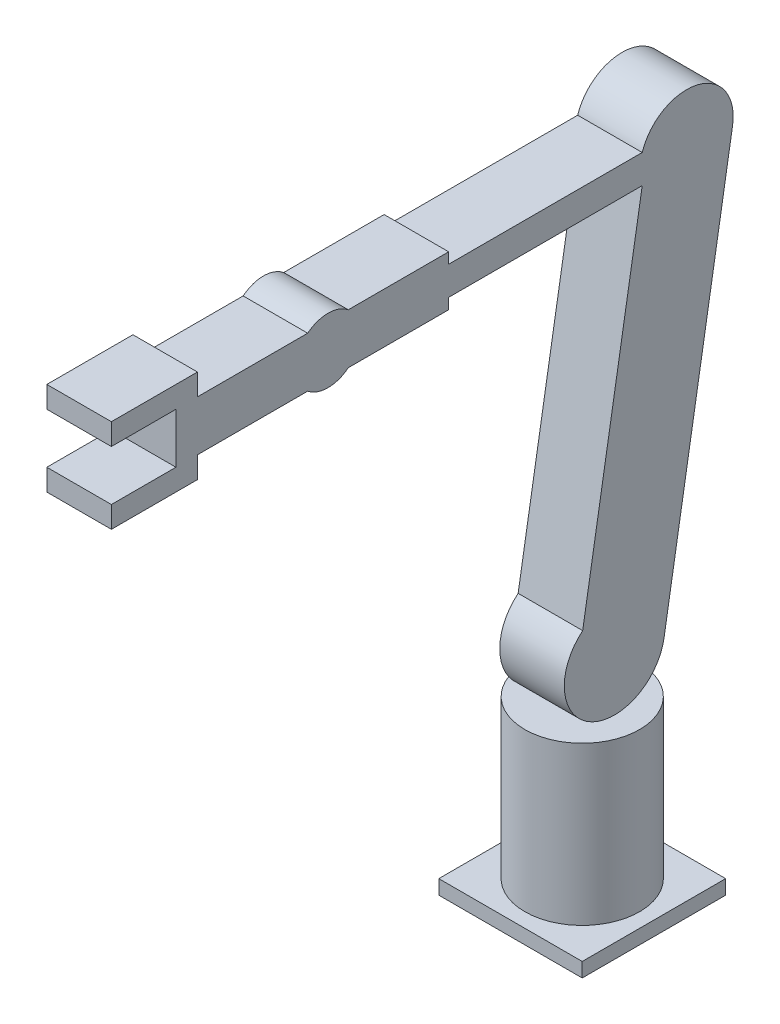
ISO-10303-21;
HEADER;
FILE_DESCRIPTION(('STEP AP214'),'2;1');
FILE_NAME('part.step','',(''),(''),'','','');
FILE_SCHEMA(('AUTOMOTIVE_DESIGN { 1 0 10303 214 1 1 1 1 }'));
ENDSEC;
DATA;
#1=APPLICATION_CONTEXT('core data for automotive mechanical design processes');
#2=APPLICATION_PROTOCOL_DEFINITION('international standard','automotive_design',2000,#1);
#3=PRODUCT_CONTEXT('',#1,'mechanical');
#4=PRODUCT('Part','Part','',(#3));
#5=PRODUCT_RELATED_PRODUCT_CATEGORY('part','',(#4));
#6=PRODUCT_DEFINITION_FORMATION('','',#4);
#7=PRODUCT_DEFINITION_CONTEXT('part definition',#1,'design');
#8=PRODUCT_DEFINITION('design','',#6,#7);
#9=PRODUCT_DEFINITION_SHAPE('','',#8);
#10=(LENGTH_UNIT() NAMED_UNIT(*) SI_UNIT(.MILLI.,.METRE.));
#11=(NAMED_UNIT(*) PLANE_ANGLE_UNIT() SI_UNIT($,.RADIAN.));
#12=(NAMED_UNIT(*) SI_UNIT($,.STERADIAN.) SOLID_ANGLE_UNIT());
#13=UNCERTAINTY_MEASURE_WITH_UNIT(LENGTH_MEASURE(1.E-05),#10,'distance_accuracy_value','');
#14=(GEOMETRIC_REPRESENTATION_CONTEXT(3) GLOBAL_UNCERTAINTY_ASSIGNED_CONTEXT((#13)) GLOBAL_UNIT_ASSIGNED_CONTEXT((#10,
#11,#12)) REPRESENTATION_CONTEXT('',''));
#15=CARTESIAN_POINT('',(0.,0.,0.));
#16=DIRECTION('',(0.,0.,1.));
#17=DIRECTION('',(1.,0.,0.));
#18=AXIS2_PLACEMENT_3D('',#15,#16,#17);
#19=CARTESIAN_POINT('',(-22.5,0.,0.));
#20=DIRECTION('',(1.,0.,0.));
#21=DIRECTION('',(0.,0.,-1.));
#22=AXIS2_PLACEMENT_3D('',#19,#20,#21);
#23=PLANE('',#22);
#24=CARTESIAN_POINT('',(-22.5,145.,0.));
#25=DIRECTION('',(1.,0.,0.));
#26=DIRECTION('',(0.,0.,-1.));
#27=AXIS2_PLACEMENT_3D('',#24,#25,#26);
#28=CIRCLE('',#27,35.);
#29=CARTESIAN_POINT('',(-22.5,172.073958792117,22.1810900391025));
#30=VERTEX_POINT('',#29);
#31=CARTESIAN_POINT('',(-22.5,139.220300396326,-34.5194882999631));
#32=VERTEX_POINT('',#31);
#33=EDGE_CURVE('E767',#30,#32,#28,.T.);
#34=ORIENTED_EDGE('',*,*,#33,.F.);
#35=DIRECTION('',(0.,0.98627109428466,-0.16513427439069));
#36=VECTOR('',#35,1.);
#37=CARTESIAN_POINT('',(-22.5,172.073958792117,22.1810900391025));
#38=LINE('',#37,#36);
#39=CARTESIAN_POINT('',(-22.5,420.,-19.3298973097812));
#40=VERTEX_POINT('',#39);
#41=EDGE_CURVE('E477',#30,#40,#38,.T.);
#42=ORIENTED_EDGE('',*,*,#41,.T.);
#43=DIRECTION('',(0.,0.,-1.));
#44=VECTOR('',#43,1.);
#45=CARTESIAN_POINT('',(-22.5,420.,115.604674874356));
#46=LINE('',#45,#44);
#47=CARTESIAN_POINT('',(-22.5,420.,115.604674874355));
#48=VERTEX_POINT('',#47);
#49=EDGE_CURVE('E557',#48,#40,#46,.T.);
#50=ORIENTED_EDGE('',*,*,#49,.F.);
#51=DIRECTION('',(0.,-1.,0.));
#52=VECTOR('',#51,1.);
#53=CARTESIAN_POINT('',(-22.5,447.5,115.604674874355));
#54=LINE('',#53,#52);
#55=CARTESIAN_POINT('',(-22.5,412.5,115.604674874355));
#56=VERTEX_POINT('',#55);
#57=EDGE_CURVE('E533',#48,#56,#54,.T.);
#58=ORIENTED_EDGE('',*,*,#57,.T.);
#59=DIRECTION('',(0.,0.,-1.));
#60=VECTOR('',#59,1.);
#61=CARTESIAN_POINT('',(-22.5,412.5,185.604674874355));
#62=LINE('',#61,#60);
#63=CARTESIAN_POINT('',(-22.5,412.5,185.604674874355));
#64=VERTEX_POINT('',#63);
#65=EDGE_CURVE('E529',#64,#56,#62,.T.);
#66=ORIENTED_EDGE('',*,*,#65,.F.);
#67=CARTESIAN_POINT('',(-22.5,430.,199.746810498086));
#68=DIRECTION('',(1.,0.,0.));
#69=DIRECTION('',(0.,0.,-1.));
#70=AXIS2_PLACEMENT_3D('',#67,#68,#69);
#71=CIRCLE('',#70,22.5);
#72=CARTESIAN_POINT('',(-22.5,412.5,213.888946121817));
#73=VERTEX_POINT('',#72);
#74=EDGE_CURVE('E510',#73,#64,#71,.T.);
#75=ORIENTED_EDGE('',*,*,#74,.F.);
#76=DIRECTION('',(0.,0.,1.));
#77=VECTOR('',#76,1.);
#78=CARTESIAN_POINT('',(-22.5,412.5,213.888946121817));
#79=LINE('',#78,#77);
#80=CARTESIAN_POINT('',(-22.5,412.5,290.746810498086));
#81=VERTEX_POINT('',#80);
#82=EDGE_CURVE('E479',#73,#81,#79,.T.);
#83=ORIENTED_EDGE('',*,*,#82,.T.);
#84=DIRECTION('',(0.,-1.,0.));
#85=VECTOR('',#84,1.);
#86=CARTESIAN_POINT('',(-22.5,462.5,290.746810498086));
#87=LINE('',#86,#85);
#88=CARTESIAN_POINT('',(-22.5,397.5,290.746810498086));
#89=VERTEX_POINT('',#88);
#90=EDGE_CURVE('E439',#81,#89,#87,.T.);
#91=ORIENTED_EDGE('',*,*,#90,.T.);
#92=DIRECTION('',(0.,0.,-1.));
#93=VECTOR('',#92,1.);
#94=CARTESIAN_POINT('',(-22.5,397.5,305.746810498086));
#95=LINE('',#94,#93);
#96=CARTESIAN_POINT('',(-22.5,397.5,350.746810498086));
#97=VERTEX_POINT('',#96);
#98=EDGE_CURVE('E432',#97,#89,#95,.T.);
#99=ORIENTED_EDGE('',*,*,#98,.F.);
#100=DIRECTION('',(0.,1.,0.));
#101=VECTOR('',#100,1.);
#102=CARTESIAN_POINT('',(-22.5,397.5,350.746810498086));
#103=LINE('',#102,#101);
#104=CARTESIAN_POINT('',(-22.5,412.5,350.746810498086));
#105=VERTEX_POINT('',#104);
#106=EDGE_CURVE('E436',#97,#105,#103,.T.);
#107=ORIENTED_EDGE('',*,*,#106,.T.);
#108=DIRECTION('',(0.,0.,1.));
#109=VECTOR('',#108,1.);
#110=CARTESIAN_POINT('',(-22.5,412.5,290.746810498086));
#111=LINE('',#110,#109);
#112=CARTESIAN_POINT('',(-22.5,412.5,305.746810498086));
#113=VERTEX_POINT('',#112);
#114=EDGE_CURVE('E426',#113,#105,#111,.T.);
#115=ORIENTED_EDGE('',*,*,#114,.F.);
#116=DIRECTION('',(0.,-1.,0.));
#117=VECTOR('',#116,1.);
#118=CARTESIAN_POINT('',(-22.5,462.5,305.746810498086));
#119=LINE('',#118,#117);
#120=CARTESIAN_POINT('',(-22.5,447.5,305.746810498086));
#121=VERTEX_POINT('',#120);
#122=EDGE_CURVE('E622',#121,#113,#119,.T.);
#123=ORIENTED_EDGE('',*,*,#122,.F.);
#124=DIRECTION('',(0.,0.,1.));
#125=VECTOR('',#124,1.);
#126=CARTESIAN_POINT('',(-22.5,447.5,290.746810498086));
#127=LINE('',#126,#125);
#128=CARTESIAN_POINT('',(-22.5,447.5,350.746810498086));
#129=VERTEX_POINT('',#128);
#130=EDGE_CURVE('E472',#121,#129,#127,.T.);
#131=ORIENTED_EDGE('',*,*,#130,.T.);
#132=DIRECTION('',(0.,-1.,0.));
#133=VECTOR('',#132,1.);
#134=CARTESIAN_POINT('',(-22.5,462.5,350.746810498086));
#135=LINE('',#134,#133);
#136=CARTESIAN_POINT('',(-22.5,462.5,350.746810498086));
#137=VERTEX_POINT('',#136);
#138=EDGE_CURVE('E600',#137,#129,#135,.T.);
#139=ORIENTED_EDGE('',*,*,#138,.F.);
#140=DIRECTION('',(0.,0.,1.));
#141=VECTOR('',#140,1.);
#142=CARTESIAN_POINT('',(-22.5,462.5,290.746810498086));
#143=LINE('',#142,#141);
#144=CARTESIAN_POINT('',(-22.5,462.5,290.746810498086));
#145=VERTEX_POINT('',#144);
#146=EDGE_CURVE('E604',#145,#137,#143,.T.);
#147=ORIENTED_EDGE('',*,*,#146,.F.);
#148=DIRECTION('',(0.,-1.,0.));
#149=VECTOR('',#148,1.);
#150=CARTESIAN_POINT('',(-22.5,462.5,290.746810498086));
#151=LINE('',#150,#149);
#152=CARTESIAN_POINT('',(-22.5,447.5,290.746810498086));
#153=VERTEX_POINT('',#152);
#154=EDGE_CURVE('E586',#145,#153,#151,.T.);
#155=ORIENTED_EDGE('',*,*,#154,.T.);
#156=DIRECTION('',(0.,0.,1.));
#157=VECTOR('',#156,1.);
#158=CARTESIAN_POINT('',(-22.5,447.5,213.888946121817));
#159=LINE('',#158,#157);
#160=CARTESIAN_POINT('',(-22.5,447.5,213.888946121817));
#161=VERTEX_POINT('',#160);
#162=EDGE_CURVE('E482',#161,#153,#159,.T.);
#163=ORIENTED_EDGE('',*,*,#162,.F.);
#164=CARTESIAN_POINT('',(-22.5,447.5,185.604674874355));
#165=VERTEX_POINT('',#164);
#166=EDGE_CURVE('E716',#165,#161,#71,.T.);
#167=ORIENTED_EDGE('',*,*,#166,.F.);
#168=DIRECTION('',(0.,0.,-1.));
#169=VECTOR('',#168,1.);
#170=CARTESIAN_POINT('',(-22.5,447.5,185.604674874355));
#171=LINE('',#170,#169);
#172=CARTESIAN_POINT('',(-22.5,447.5,115.604674874355));
#173=VERTEX_POINT('',#172);
#174=EDGE_CURVE('E519',#165,#173,#171,.T.);
#175=ORIENTED_EDGE('',*,*,#174,.T.);
#176=CARTESIAN_POINT('',(-22.5,440.,115.604674874355));
#177=VERTEX_POINT('',#176);
#178=EDGE_CURVE('E535',#173,#177,#54,.T.);
#179=ORIENTED_EDGE('',*,*,#178,.T.);
#180=DIRECTION('',(0.,0.,-1.));
#181=VECTOR('',#180,1.);
#182=CARTESIAN_POINT('',(-22.5,440.,115.604674874356));
#183=LINE('',#182,#181);
#184=CARTESIAN_POINT('',(-22.5,440.,-19.3298973097812));
#185=VERTEX_POINT('',#184);
#186=EDGE_CURVE('E553',#177,#185,#183,.T.);
#187=ORIENTED_EDGE('',*,*,#186,.T.);
#188=CARTESIAN_POINT('',(-22.5,430.,-50.2531895019136));
#189=DIRECTION('',(1.,0.,0.));
#190=DIRECTION('',(0.,0.,-1.));
#191=AXIS2_PLACEMENT_3D('',#188,#189,#190);
#192=CIRCLE('',#191,32.5);
#193=CARTESIAN_POINT('',(-22.5,424.633136082303,-82.307000066165));
#194=VERTEX_POINT('',#193);
#195=EDGE_CURVE('E702',#194,#185,#192,.T.);
#196=ORIENTED_EDGE('',*,*,#195,.F.);
#197=DIRECTION('',(0.,-0.98627109428466,0.16513427439069));
#198=VECTOR('',#197,1.);
#199=CARTESIAN_POINT('',(-22.5,424.633136082303,-82.307000066165));
#200=LINE('',#199,#198);
#201=EDGE_CURVE('E573',#194,#32,#200,.T.);
#202=ORIENTED_EDGE('',*,*,#201,.T.);
#203=EDGE_LOOP('',(#34,#42,#50,#58,#66,#75,#83,#91,#99,#107,#115,#123,#131,#139,#147,#155,#163,
#167,#175,#179,#187,#196,#202));
#204=FACE_BOUND('',#203,.T.);
#205=ADVANCED_FACE('F273',(#204),#23,.F.);
#206=CARTESIAN_POINT('',(22.5,145.,0.));
#207=DIRECTION('',(-1.,0.,0.));
#208=DIRECTION('',(0.,0.,1.));
#209=AXIS2_PLACEMENT_3D('',#206,#207,#208);
#210=CYLINDRICAL_SURFACE('',#209,35.);
#211=ORIENTED_EDGE('',*,*,#33,.T.);
#212=DIRECTION('',(-1.,0.,0.));
#213=VECTOR('',#212,1.);
#214=CARTESIAN_POINT('',(22.5,139.220300396326,-34.5194882999631));
#215=LINE('',#214,#213);
#216=CARTESIAN_POINT('',(22.5,139.220300396326,-34.5194882999631));
#217=VERTEX_POINT('',#216);
#218=EDGE_CURVE('E284',#217,#32,#215,.T.);
#219=ORIENTED_EDGE('',*,*,#218,.F.);
#220=CARTESIAN_POINT('',(22.5,145.,0.));
#221=DIRECTION('',(1.,0.,0.));
#222=DIRECTION('',(0.,0.,-1.));
#223=AXIS2_PLACEMENT_3D('',#220,#221,#222);
#224=CIRCLE('',#223,35.);
#225=CARTESIAN_POINT('',(22.5,172.073958792117,22.1810900391025));
#226=VERTEX_POINT('',#225);
#227=EDGE_CURVE('E777',#226,#217,#224,.T.);
#228=ORIENTED_EDGE('',*,*,#227,.F.);
#229=DIRECTION('',(-1.,0.,0.));
#230=VECTOR('',#229,1.);
#231=CARTESIAN_POINT('',(22.5,172.073958792117,22.1810900391025));
#232=LINE('',#231,#230);
#233=EDGE_CURVE('E13',#226,#30,#232,.T.);
#234=ORIENTED_EDGE('',*,*,#233,.T.);
#235=EDGE_LOOP('',(#211,#219,#228,#234));
#236=FACE_BOUND('',#235,.T.);
#237=ADVANCED_FACE('F657',(#236),#210,.T.);
#238=CARTESIAN_POINT('',(22.5,0.,0.));
#239=DIRECTION('',(1.,0.,0.));
#240=DIRECTION('',(0.,0.,-1.));
#241=AXIS2_PLACEMENT_3D('',#238,#239,#240);
#242=PLANE('',#241);
#243=ORIENTED_EDGE('',*,*,#227,.T.);
#244=DIRECTION('',(0.,-0.98627109428466,0.16513427439069));
#245=VECTOR('',#244,1.);
#246=CARTESIAN_POINT('',(22.5,424.633136082303,-82.307000066165));
#247=LINE('',#246,#245);
#248=CARTESIAN_POINT('',(22.5,424.633136082303,-82.307000066165));
#249=VERTEX_POINT('',#248);
#250=EDGE_CURVE('E561',#249,#217,#247,.T.);
#251=ORIENTED_EDGE('',*,*,#250,.F.);
#252=CARTESIAN_POINT('',(22.5,430.,-50.2531895019136));
#253=DIRECTION('',(1.,0.,0.));
#254=DIRECTION('',(0.,0.,-1.));
#255=AXIS2_PLACEMENT_3D('',#252,#253,#254);
#256=CIRCLE('',#255,32.5);
#257=CARTESIAN_POINT('',(22.5,440.,-19.3298973097812));
#258=VERTEX_POINT('',#257);
#259=EDGE_CURVE('E768',#249,#258,#256,.T.);
#260=ORIENTED_EDGE('',*,*,#259,.T.);
#261=DIRECTION('',(0.,0.,-1.));
#262=VECTOR('',#261,1.);
#263=CARTESIAN_POINT('',(22.5,440.,115.604674874356));
#264=LINE('',#263,#262);
#265=CARTESIAN_POINT('',(22.5,440.,115.604674874355));
#266=VERTEX_POINT('',#265);
#267=EDGE_CURVE('E534',#266,#258,#264,.T.);
#268=ORIENTED_EDGE('',*,*,#267,.F.);
#269=DIRECTION('',(0.,-1.,0.));
#270=VECTOR('',#269,1.);
#271=CARTESIAN_POINT('',(22.5,447.5,115.604674874355));
#272=LINE('',#271,#270);
#273=CARTESIAN_POINT('',(22.5,447.5,115.604674874355));
#274=VERTEX_POINT('',#273);
#275=EDGE_CURVE('E520',#274,#266,#272,.T.);
#276=ORIENTED_EDGE('',*,*,#275,.F.);
#277=DIRECTION('',(0.,0.,-1.));
#278=VECTOR('',#277,1.);
#279=CARTESIAN_POINT('',(22.5,447.5,185.604674874355));
#280=LINE('',#279,#278);
#281=CARTESIAN_POINT('',(22.5,447.5,185.604674874355));
#282=VERTEX_POINT('',#281);
#283=EDGE_CURVE('E524',#282,#274,#280,.T.);
#284=ORIENTED_EDGE('',*,*,#283,.F.);
#285=CARTESIAN_POINT('',(22.5,430.,199.746810498086));
#286=DIRECTION('',(1.,0.,0.));
#287=DIRECTION('',(0.,0.,-1.));
#288=AXIS2_PLACEMENT_3D('',#285,#286,#287);
#289=CIRCLE('',#288,22.5);
#290=CARTESIAN_POINT('',(22.5,447.5,213.888946121817));
#291=VERTEX_POINT('',#290);
#292=EDGE_CURVE('E715',#282,#291,#289,.T.);
#293=ORIENTED_EDGE('',*,*,#292,.T.);
#294=DIRECTION('',(0.,0.,1.));
#295=VECTOR('',#294,1.);
#296=CARTESIAN_POINT('',(22.5,447.5,213.888946121817));
#297=LINE('',#296,#295);
#298=CARTESIAN_POINT('',(22.5,447.5,290.746810498086));
#299=VERTEX_POINT('',#298);
#300=EDGE_CURVE('E495',#291,#299,#297,.T.);
#301=ORIENTED_EDGE('',*,*,#300,.T.);
#302=DIRECTION('',(0.,-1.,0.));
#303=VECTOR('',#302,1.);
#304=CARTESIAN_POINT('',(22.5,462.5,290.746810498086));
#305=LINE('',#304,#303);
#306=CARTESIAN_POINT('',(22.5,462.5,290.746810498086));
#307=VERTEX_POINT('',#306);
#308=EDGE_CURVE('E593',#307,#299,#305,.T.);
#309=ORIENTED_EDGE('',*,*,#308,.F.);
#310=DIRECTION('',(0.,0.,1.));
#311=VECTOR('',#310,1.);
#312=CARTESIAN_POINT('',(22.5,462.5,290.746810498086));
#313=LINE('',#312,#311);
#314=CARTESIAN_POINT('',(22.5,462.5,350.746810498086));
#315=VERTEX_POINT('',#314);
#316=EDGE_CURVE('E590',#307,#315,#313,.T.);
#317=ORIENTED_EDGE('',*,*,#316,.T.);
#318=DIRECTION('',(0.,-1.,0.));
#319=VECTOR('',#318,1.);
#320=CARTESIAN_POINT('',(22.5,462.5,350.746810498086));
#321=LINE('',#320,#319);
#322=CARTESIAN_POINT('',(22.5,447.5,350.746810498086));
#323=VERTEX_POINT('',#322);
#324=EDGE_CURVE('E585',#315,#323,#321,.T.);
#325=ORIENTED_EDGE('',*,*,#324,.T.);
#326=DIRECTION('',(0.,0.,1.));
#327=VECTOR('',#326,1.);
#328=CARTESIAN_POINT('',(22.5,447.5,290.746810498086));
#329=LINE('',#328,#327);
#330=CARTESIAN_POINT('',(22.5,447.5,305.746810498086));
#331=VERTEX_POINT('',#330);
#332=EDGE_CURVE('E582',#331,#323,#329,.T.);
#333=ORIENTED_EDGE('',*,*,#332,.F.);
#334=DIRECTION('',(0.,-1.,0.));
#335=VECTOR('',#334,1.);
#336=CARTESIAN_POINT('',(22.5,462.5,305.746810498086));
#337=LINE('',#336,#335);
#338=CARTESIAN_POINT('',(22.5,412.5,305.746810498086));
#339=VERTEX_POINT('',#338);
#340=EDGE_CURVE('E625',#331,#339,#337,.T.);
#341=ORIENTED_EDGE('',*,*,#340,.T.);
#342=DIRECTION('',(0.,0.,1.));
#343=VECTOR('',#342,1.);
#344=CARTESIAN_POINT('',(22.5,412.5,290.746810498086));
#345=LINE('',#344,#343);
#346=CARTESIAN_POINT('',(22.5,412.5,350.746810498086));
#347=VERTEX_POINT('',#346);
#348=EDGE_CURVE('E459',#339,#347,#345,.T.);
#349=ORIENTED_EDGE('',*,*,#348,.T.);
#350=DIRECTION('',(0.,1.,0.));
#351=VECTOR('',#350,1.);
#352=CARTESIAN_POINT('',(22.5,397.5,350.746810498086));
#353=LINE('',#352,#351);
#354=CARTESIAN_POINT('',(22.5,397.5,350.746810498086));
#355=VERTEX_POINT('',#354);
#356=EDGE_CURVE('E455',#355,#347,#353,.T.);
#357=ORIENTED_EDGE('',*,*,#356,.F.);
#358=DIRECTION('',(0.,0.,-1.));
#359=VECTOR('',#358,1.);
#360=CARTESIAN_POINT('',(22.5,397.5,305.746810498086));
#361=LINE('',#360,#359);
#362=CARTESIAN_POINT('',(22.5,397.5,290.746810498086));
#363=VERTEX_POINT('',#362);
#364=EDGE_CURVE('E450',#355,#363,#361,.T.);
#365=ORIENTED_EDGE('',*,*,#364,.T.);
#366=DIRECTION('',(0.,-1.,0.));
#367=VECTOR('',#366,1.);
#368=CARTESIAN_POINT('',(22.5,462.5,290.746810498086));
#369=LINE('',#368,#367);
#370=CARTESIAN_POINT('',(22.5,412.5,290.746810498086));
#371=VERTEX_POINT('',#370);
#372=EDGE_CURVE('E621',#371,#363,#369,.T.);
#373=ORIENTED_EDGE('',*,*,#372,.F.);
#374=DIRECTION('',(0.,0.,1.));
#375=VECTOR('',#374,1.);
#376=CARTESIAN_POINT('',(22.5,412.5,213.888946121817));
#377=LINE('',#376,#375);
#378=CARTESIAN_POINT('',(22.5,412.5,213.888946121817));
#379=VERTEX_POINT('',#378);
#380=EDGE_CURVE('E489',#379,#371,#377,.T.);
#381=ORIENTED_EDGE('',*,*,#380,.F.);
#382=CARTESIAN_POINT('',(22.5,412.5,185.604674874355));
#383=VERTEX_POINT('',#382);
#384=EDGE_CURVE('E707',#379,#383,#289,.T.);
#385=ORIENTED_EDGE('',*,*,#384,.T.);
#386=DIRECTION('',(0.,0.,-1.));
#387=VECTOR('',#386,1.);
#388=CARTESIAN_POINT('',(22.5,412.5,185.604674874355));
#389=LINE('',#388,#387);
#390=CARTESIAN_POINT('',(22.5,412.5,115.604674874355));
#391=VERTEX_POINT('',#390);
#392=EDGE_CURVE('E514',#383,#391,#389,.T.);
#393=ORIENTED_EDGE('',*,*,#392,.T.);
#394=CARTESIAN_POINT('',(22.5,420.,115.604674874355));
#395=VERTEX_POINT('',#394);
#396=EDGE_CURVE('E518',#395,#391,#272,.T.);
#397=ORIENTED_EDGE('',*,*,#396,.F.);
#398=DIRECTION('',(0.,0.,-1.));
#399=VECTOR('',#398,1.);
#400=CARTESIAN_POINT('',(22.5,420.,115.604674874356));
#401=LINE('',#400,#399);
#402=CARTESIAN_POINT('',(22.5,420.,-19.3298973097812));
#403=VERTEX_POINT('',#402);
#404=EDGE_CURVE('E549',#395,#403,#401,.T.);
#405=ORIENTED_EDGE('',*,*,#404,.T.);
#406=DIRECTION('',(0.,0.98627109428466,-0.16513427439069));
#407=VECTOR('',#406,1.);
#408=CARTESIAN_POINT('',(22.5,172.073958792117,22.1810900391025));
#409=LINE('',#408,#407);
#410=EDGE_CURVE('E569',#226,#403,#409,.T.);
#411=ORIENTED_EDGE('',*,*,#410,.F.);
#412=EDGE_LOOP('',(#243,#251,#260,#268,#276,#284,#293,#301,#309,#317,#325,#333,#341,#349,#357,
#365,#373,#381,#385,#393,#397,#405,#411));
#413=FACE_BOUND('',#412,.T.);
#414=ADVANCED_FACE('F635',(#413),#242,.T.);
#415=CARTESIAN_POINT('',(22.5,462.5,350.746810498086));
#416=DIRECTION('',(0.,0.,-1.));
#417=DIRECTION('',(-1.,0.,0.));
#418=AXIS2_PLACEMENT_3D('',#415,#416,#417);
#419=PLANE('',#418);
#420=ORIENTED_EDGE('',*,*,#138,.T.);
#421=DIRECTION('',(-1.,0.,0.));
#422=VECTOR('',#421,1.);
#423=CARTESIAN_POINT('',(22.5,447.5,350.746810498086));
#424=LINE('',#423,#422);
#425=EDGE_CURVE('E597',#323,#129,#424,.T.);
#426=ORIENTED_EDGE('',*,*,#425,.F.);
#427=ORIENTED_EDGE('',*,*,#324,.F.);
#428=DIRECTION('',(-1.,0.,0.));
#429=VECTOR('',#428,1.);
#430=CARTESIAN_POINT('',(22.5,462.5,350.746810498086));
#431=LINE('',#430,#429);
#432=EDGE_CURVE('E612',#315,#137,#431,.T.);
#433=ORIENTED_EDGE('',*,*,#432,.T.);
#434=EDGE_LOOP('',(#420,#426,#427,#433));
#435=FACE_BOUND('',#434,.T.);
#436=ADVANCED_FACE('F650',(#435),#419,.F.);
#437=CARTESIAN_POINT('',(22.5,397.5,350.746810498086));
#438=DIRECTION('',(0.,0.,1.));
#439=DIRECTION('',(1.,0.,0.));
#440=AXIS2_PLACEMENT_3D('',#437,#438,#439);
#441=PLANE('',#440);
#442=ORIENTED_EDGE('',*,*,#106,.F.);
#443=DIRECTION('',(-1.,0.,0.));
#444=VECTOR('',#443,1.);
#445=CARTESIAN_POINT('',(22.5,397.5,350.746810498086));
#446=LINE('',#445,#444);
#447=EDGE_CURVE('E447',#355,#97,#446,.T.);
#448=ORIENTED_EDGE('',*,*,#447,.F.);
#449=ORIENTED_EDGE('',*,*,#356,.T.);
#450=DIRECTION('',(-1.,0.,0.));
#451=VECTOR('',#450,1.);
#452=CARTESIAN_POINT('',(22.5,412.5,350.746810498086));
#453=LINE('',#452,#451);
#454=EDGE_CURVE('E444',#347,#105,#453,.T.);
#455=ORIENTED_EDGE('',*,*,#454,.T.);
#456=EDGE_LOOP('',(#442,#448,#449,#455));
#457=FACE_BOUND('',#456,.T.);
#458=ADVANCED_FACE('F457',(#457),#441,.T.);
#459=CARTESIAN_POINT('',(22.5,412.5,290.746810498086));
#460=DIRECTION('',(0.,-1.,0.));
#461=DIRECTION('',(0.,0.,-1.));
#462=AXIS2_PLACEMENT_3D('',#459,#460,#461);
#463=PLANE('',#462);
#464=ORIENTED_EDGE('',*,*,#348,.F.);
#465=DIRECTION('',(-1.,0.,0.));
#466=VECTOR('',#465,1.);
#467=CARTESIAN_POINT('',(22.5,412.5,305.746810498086));
#468=LINE('',#467,#466);
#469=EDGE_CURVE('E469',#339,#113,#468,.T.);
#470=ORIENTED_EDGE('',*,*,#469,.T.);
#471=ORIENTED_EDGE('',*,*,#114,.T.);
#472=ORIENTED_EDGE('',*,*,#454,.F.);
#473=EDGE_LOOP('',(#464,#470,#471,#472));
#474=FACE_BOUND('',#473,.T.);
#475=ADVANCED_FACE('F275',(#474),#463,.F.);
#476=CARTESIAN_POINT('',(22.5,447.5,290.746810498086));
#477=DIRECTION('',(0.,-1.,0.));
#478=DIRECTION('',(0.,0.,-1.));
#479=AXIS2_PLACEMENT_3D('',#476,#477,#478);
#480=PLANE('',#479);
#481=ORIENTED_EDGE('',*,*,#130,.F.);
#482=DIRECTION('',(1.,0.,0.));
#483=VECTOR('',#482,1.);
#484=CARTESIAN_POINT('',(22.5,447.5,305.746810498086));
#485=LINE('',#484,#483);
#486=EDGE_CURVE('E474',#121,#331,#485,.T.);
#487=ORIENTED_EDGE('',*,*,#486,.T.);
#488=ORIENTED_EDGE('',*,*,#332,.T.);
#489=ORIENTED_EDGE('',*,*,#425,.T.);
#490=EDGE_LOOP('',(#481,#487,#488,#489));
#491=FACE_BOUND('',#490,.T.);
#492=ADVANCED_FACE('F642',(#491),#480,.T.);
#493=CARTESIAN_POINT('',(22.5,462.5,290.746810498086));
#494=DIRECTION('',(0.,-1.,0.));
#495=DIRECTION('',(0.,0.,-1.));
#496=AXIS2_PLACEMENT_3D('',#493,#494,#495);
#497=PLANE('',#496);
#498=ORIENTED_EDGE('',*,*,#432,.F.);
#499=ORIENTED_EDGE('',*,*,#316,.F.);
#500=DIRECTION('',(-1.,0.,0.));
#501=VECTOR('',#500,1.);
#502=CARTESIAN_POINT('',(22.5,462.5,290.746810498086));
#503=LINE('',#502,#501);
#504=EDGE_CURVE('E478',#307,#145,#503,.T.);
#505=ORIENTED_EDGE('',*,*,#504,.T.);
#506=ORIENTED_EDGE('',*,*,#146,.T.);
#507=EDGE_LOOP('',(#498,#499,#505,#506));
#508=FACE_BOUND('',#507,.T.);
#509=ADVANCED_FACE('F647',(#508),#497,.F.);
#510=CARTESIAN_POINT('',(22.5,397.5,290.746810498086));
#511=DIRECTION('',(0.,-1.,0.));
#512=DIRECTION('',(0.,0.,-1.));
#513=AXIS2_PLACEMENT_3D('',#510,#511,#512);
#514=PLANE('',#513);
#515=ORIENTED_EDGE('',*,*,#447,.T.);
#516=ORIENTED_EDGE('',*,*,#98,.T.);
#517=DIRECTION('',(-1.,0.,0.));
#518=VECTOR('',#517,1.);
#519=CARTESIAN_POINT('',(22.5,397.5,290.746810498086));
#520=LINE('',#519,#518);
#521=EDGE_CURVE('E473',#363,#89,#520,.T.);
#522=ORIENTED_EDGE('',*,*,#521,.F.);
#523=ORIENTED_EDGE('',*,*,#364,.F.);
#524=EDGE_LOOP('',(#515,#516,#522,#523));
#525=FACE_BOUND('',#524,.T.);
#526=ADVANCED_FACE('F448',(#525),#514,.T.);
#527=CARTESIAN_POINT('',(22.5,462.5,305.746810498086));
#528=DIRECTION('',(0.,0.,-1.));
#529=DIRECTION('',(-1.,0.,0.));
#530=AXIS2_PLACEMENT_3D('',#527,#528,#529);
#531=PLANE('',#530);
#532=ORIENTED_EDGE('',*,*,#486,.F.);
#533=ORIENTED_EDGE('',*,*,#122,.T.);
#534=ORIENTED_EDGE('',*,*,#469,.F.);
#535=ORIENTED_EDGE('',*,*,#340,.F.);
#536=EDGE_LOOP('',(#532,#533,#534,#535));
#537=FACE_BOUND('',#536,.T.);
#538=ADVANCED_FACE('F662',(#537),#531,.F.);
#539=CARTESIAN_POINT('',(22.5,462.5,290.746810498086));
#540=DIRECTION('',(0.,0.,-1.));
#541=DIRECTION('',(-1.,0.,0.));
#542=AXIS2_PLACEMENT_3D('',#539,#540,#541);
#543=PLANE('',#542);
#544=ORIENTED_EDGE('',*,*,#154,.F.);
#545=ORIENTED_EDGE('',*,*,#504,.F.);
#546=ORIENTED_EDGE('',*,*,#308,.T.);
#547=DIRECTION('',(-1.,0.,0.));
#548=VECTOR('',#547,1.);
#549=CARTESIAN_POINT('',(22.5,447.5,290.746810498086));
#550=LINE('',#549,#548);
#551=EDGE_CURVE('E505',#299,#153,#550,.T.);
#552=ORIENTED_EDGE('',*,*,#551,.T.);
#553=EDGE_LOOP('',(#544,#545,#546,#552));
#554=FACE_BOUND('',#553,.T.);
#555=ADVANCED_FACE('F665',(#554),#543,.T.);
#556=CARTESIAN_POINT('',(22.5,462.5,290.746810498086));
#557=DIRECTION('',(0.,0.,-1.));
#558=DIRECTION('',(-1.,0.,0.));
#559=AXIS2_PLACEMENT_3D('',#556,#557,#558);
#560=PLANE('',#559);
#561=DIRECTION('',(-1.,0.,0.));
#562=VECTOR('',#561,1.);
#563=CARTESIAN_POINT('',(22.5,412.5,290.746810498086));
#564=LINE('',#563,#562);
#565=EDGE_CURVE('E499',#371,#81,#564,.T.);
#566=ORIENTED_EDGE('',*,*,#565,.F.);
#567=ORIENTED_EDGE('',*,*,#372,.T.);
#568=ORIENTED_EDGE('',*,*,#521,.T.);
#569=ORIENTED_EDGE('',*,*,#90,.F.);
#570=EDGE_LOOP('',(#566,#567,#568,#569));
#571=FACE_BOUND('',#570,.T.);
#572=ADVANCED_FACE('F667',(#571),#560,.T.);
#573=CARTESIAN_POINT('',(22.5,447.5,213.888946121817));
#574=DIRECTION('',(0.,-1.,0.));
#575=DIRECTION('',(0.,0.,-1.));
#576=AXIS2_PLACEMENT_3D('',#573,#574,#575);
#577=PLANE('',#576);
#578=ORIENTED_EDGE('',*,*,#162,.T.);
#579=ORIENTED_EDGE('',*,*,#551,.F.);
#580=ORIENTED_EDGE('',*,*,#300,.F.);
#581=DIRECTION('',(-1.,0.,0.));
#582=VECTOR('',#581,1.);
#583=CARTESIAN_POINT('',(22.5,447.5,213.888946121817));
#584=LINE('',#583,#582);
#585=EDGE_CURVE('E693',#291,#161,#584,.T.);
#586=ORIENTED_EDGE('',*,*,#585,.T.);
#587=EDGE_LOOP('',(#578,#579,#580,#586));
#588=FACE_BOUND('',#587,.T.);
#589=ADVANCED_FACE('F670',(#588),#577,.F.);
#590=CARTESIAN_POINT('',(22.5,412.5,213.888946121817));
#591=DIRECTION('',(0.,-1.,0.));
#592=DIRECTION('',(0.,0.,-1.));
#593=AXIS2_PLACEMENT_3D('',#590,#591,#592);
#594=PLANE('',#593);
#595=ORIENTED_EDGE('',*,*,#82,.F.);
#596=DIRECTION('',(-1.,0.,0.));
#597=VECTOR('',#596,1.);
#598=CARTESIAN_POINT('',(22.5,412.5,213.888946121817));
#599=LINE('',#598,#597);
#600=EDGE_CURVE('E697',#379,#73,#599,.T.);
#601=ORIENTED_EDGE('',*,*,#600,.F.);
#602=ORIENTED_EDGE('',*,*,#380,.T.);
#603=ORIENTED_EDGE('',*,*,#565,.T.);
#604=EDGE_LOOP('',(#595,#601,#602,#603));
#605=FACE_BOUND('',#604,.T.);
#606=ADVANCED_FACE('F807',(#605),#594,.T.);
#607=CARTESIAN_POINT('',(22.5,430.,199.746810498086));
#608=DIRECTION('',(-1.,0.,0.));
#609=DIRECTION('',(0.,0.,1.));
#610=AXIS2_PLACEMENT_3D('',#607,#608,#609);
#611=CYLINDRICAL_SURFACE('',#610,22.5);
#612=ORIENTED_EDGE('',*,*,#585,.F.);
#613=ORIENTED_EDGE('',*,*,#292,.F.);
#614=DIRECTION('',(-1.,0.,0.));
#615=VECTOR('',#614,1.);
#616=CARTESIAN_POINT('',(22.5,447.5,185.604674874355));
#617=LINE('',#616,#615);
#618=EDGE_CURVE('E698',#282,#165,#617,.T.);
#619=ORIENTED_EDGE('',*,*,#618,.T.);
#620=ORIENTED_EDGE('',*,*,#166,.T.);
#621=EDGE_LOOP('',(#612,#613,#619,#620));
#622=FACE_BOUND('',#621,.T.);
#623=ADVANCED_FACE('F746',(#622),#611,.T.);
#624=ORIENTED_EDGE('',*,*,#384,.F.);
#625=ORIENTED_EDGE('',*,*,#600,.T.);
#626=ORIENTED_EDGE('',*,*,#74,.T.);
#627=DIRECTION('',(-1.,0.,0.));
#628=VECTOR('',#627,1.);
#629=CARTESIAN_POINT('',(22.5,412.5,185.604674874355));
#630=LINE('',#629,#628);
#631=EDGE_CURVE('E704',#383,#64,#630,.T.);
#632=ORIENTED_EDGE('',*,*,#631,.F.);
#633=EDGE_LOOP('',(#624,#625,#626,#632));
#634=FACE_BOUND('',#633,.T.);
#635=ADVANCED_FACE('F734',(#634),#611,.T.);
#636=CARTESIAN_POINT('',(22.5,447.5,185.604674874355));
#637=DIRECTION('',(0.,1.,0.));
#638=DIRECTION('',(0.,0.,1.));
#639=AXIS2_PLACEMENT_3D('',#636,#637,#638);
#640=PLANE('',#639);
#641=ORIENTED_EDGE('',*,*,#174,.F.);
#642=ORIENTED_EDGE('',*,*,#618,.F.);
#643=ORIENTED_EDGE('',*,*,#283,.T.);
#644=DIRECTION('',(-1.,0.,0.));
#645=VECTOR('',#644,1.);
#646=CARTESIAN_POINT('',(22.5,447.5,115.604674874355));
#647=LINE('',#646,#645);
#648=EDGE_CURVE('E528',#274,#173,#647,.T.);
#649=ORIENTED_EDGE('',*,*,#648,.T.);
#650=EDGE_LOOP('',(#641,#642,#643,#649));
#651=FACE_BOUND('',#650,.T.);
#652=ADVANCED_FACE('F749',(#651),#640,.T.);
#653=CARTESIAN_POINT('',(22.5,412.5,185.604674874355));
#654=DIRECTION('',(0.,1.,0.));
#655=DIRECTION('',(0.,0.,1.));
#656=AXIS2_PLACEMENT_3D('',#653,#654,#655);
#657=PLANE('',#656);
#658=ORIENTED_EDGE('',*,*,#65,.T.);
#659=DIRECTION('',(-1.,0.,0.));
#660=VECTOR('',#659,1.);
#661=CARTESIAN_POINT('',(22.5,412.5,115.604674874355));
#662=LINE('',#661,#660);
#663=EDGE_CURVE('E544',#391,#56,#662,.T.);
#664=ORIENTED_EDGE('',*,*,#663,.F.);
#665=ORIENTED_EDGE('',*,*,#392,.F.);
#666=ORIENTED_EDGE('',*,*,#631,.T.);
#667=EDGE_LOOP('',(#658,#664,#665,#666));
#668=FACE_BOUND('',#667,.T.);
#669=ADVANCED_FACE('F741',(#668),#657,.F.);
#670=CARTESIAN_POINT('',(22.5,447.5,115.604674874355));
#671=DIRECTION('',(0.,0.,-1.));
#672=DIRECTION('',(-1.,0.,0.));
#673=AXIS2_PLACEMENT_3D('',#670,#671,#672);
#674=PLANE('',#673);
#675=ORIENTED_EDGE('',*,*,#275,.T.);
#676=DIRECTION('',(-1.,0.,0.));
#677=VECTOR('',#676,1.);
#678=CARTESIAN_POINT('',(22.5,440.,115.604674874356));
#679=LINE('',#678,#677);
#680=EDGE_CURVE('E548',#266,#177,#679,.T.);
#681=ORIENTED_EDGE('',*,*,#680,.T.);
#682=ORIENTED_EDGE('',*,*,#178,.F.);
#683=ORIENTED_EDGE('',*,*,#648,.F.);
#684=EDGE_LOOP('',(#675,#681,#682,#683));
#685=FACE_BOUND('',#684,.T.);
#686=ADVANCED_FACE('F755',(#685),#674,.T.);
#687=DIRECTION('',(-1.,0.,0.));
#688=VECTOR('',#687,1.);
#689=CARTESIAN_POINT('',(22.5,420.,115.604674874356));
#690=LINE('',#689,#688);
#691=EDGE_CURVE('E483',#395,#48,#690,.T.);
#692=ORIENTED_EDGE('',*,*,#691,.F.);
#693=ORIENTED_EDGE('',*,*,#396,.T.);
#694=ORIENTED_EDGE('',*,*,#663,.T.);
#695=ORIENTED_EDGE('',*,*,#57,.F.);
#696=EDGE_LOOP('',(#692,#693,#694,#695));
#697=FACE_BOUND('',#696,.T.);
#698=ADVANCED_FACE('F812',(#697),#674,.T.);
#699=CARTESIAN_POINT('',(22.5,440.,115.604674874356));
#700=DIRECTION('',(0.,1.,0.));
#701=DIRECTION('',(0.,0.,1.));
#702=AXIS2_PLACEMENT_3D('',#699,#700,#701);
#703=PLANE('',#702);
#704=ORIENTED_EDGE('',*,*,#186,.F.);
#705=ORIENTED_EDGE('',*,*,#680,.F.);
#706=ORIENTED_EDGE('',*,*,#267,.T.);
#707=DIRECTION('',(-1.,0.,0.));
#708=VECTOR('',#707,1.);
#709=CARTESIAN_POINT('',(22.5,440.,-19.3298973097812));
#710=LINE('',#709,#708);
#711=EDGE_CURVE('E759',#258,#185,#710,.T.);
#712=ORIENTED_EDGE('',*,*,#711,.T.);
#713=EDGE_LOOP('',(#704,#705,#706,#712));
#714=FACE_BOUND('',#713,.T.);
#715=ADVANCED_FACE('F758',(#714),#703,.T.);
#716=CARTESIAN_POINT('',(22.5,420.,115.604674874356));
#717=DIRECTION('',(0.,1.,0.));
#718=DIRECTION('',(0.,0.,1.));
#719=AXIS2_PLACEMENT_3D('',#716,#717,#718);
#720=PLANE('',#719);
#721=ORIENTED_EDGE('',*,*,#49,.T.);
#722=DIRECTION('',(-1.,0.,0.));
#723=VECTOR('',#722,1.);
#724=CARTESIAN_POINT('',(22.5,420.,-19.3298973097812));
#725=LINE('',#724,#723);
#726=EDGE_CURVE('E764',#403,#40,#725,.T.);
#727=ORIENTED_EDGE('',*,*,#726,.F.);
#728=ORIENTED_EDGE('',*,*,#404,.F.);
#729=ORIENTED_EDGE('',*,*,#691,.T.);
#730=EDGE_LOOP('',(#721,#727,#728,#729));
#731=FACE_BOUND('',#730,.T.);
#732=ADVANCED_FACE('F791',(#731),#720,.F.);
#733=CARTESIAN_POINT('',(22.5,430.,-50.2531895019136));
#734=DIRECTION('',(-1.,0.,0.));
#735=DIRECTION('',(0.,0.,1.));
#736=AXIS2_PLACEMENT_3D('',#733,#734,#735);
#737=CYLINDRICAL_SURFACE('',#736,32.5);
#738=ORIENTED_EDGE('',*,*,#195,.T.);
#739=ORIENTED_EDGE('',*,*,#711,.F.);
#740=ORIENTED_EDGE('',*,*,#259,.F.);
#741=DIRECTION('',(-1.,0.,0.));
#742=VECTOR('',#741,1.);
#743=CARTESIAN_POINT('',(22.5,424.633136082303,-82.307000066165));
#744=LINE('',#743,#742);
#745=EDGE_CURVE('E721',#249,#194,#744,.T.);
#746=ORIENTED_EDGE('',*,*,#745,.T.);
#747=EDGE_LOOP('',(#738,#739,#740,#746));
#748=FACE_BOUND('',#747,.T.);
#749=ADVANCED_FACE('F789',(#748),#737,.T.);
#750=CARTESIAN_POINT('',(22.5,424.633136082303,-82.307000066165));
#751=DIRECTION('',(0.,-0.16513427439069,-0.98627109428466));
#752=DIRECTION('',(0.,0.98627109428466,-0.16513427439069));
#753=AXIS2_PLACEMENT_3D('',#750,#751,#752);
#754=PLANE('',#753);
#755=ORIENTED_EDGE('',*,*,#201,.F.);
#756=ORIENTED_EDGE('',*,*,#745,.F.);
#757=ORIENTED_EDGE('',*,*,#250,.T.);
#758=ORIENTED_EDGE('',*,*,#218,.T.);
#759=EDGE_LOOP('',(#755,#756,#757,#758));
#760=FACE_BOUND('',#759,.T.);
#761=ADVANCED_FACE('F788',(#760),#754,.T.);
#762=CARTESIAN_POINT('',(22.5,172.073958792117,22.1810900391025));
#763=DIRECTION('',(0.,0.16513427439069,0.98627109428466));
#764=DIRECTION('',(0.,-0.98627109428466,0.16513427439069));
#765=AXIS2_PLACEMENT_3D('',#762,#763,#764);
#766=PLANE('',#765);
#767=ORIENTED_EDGE('',*,*,#41,.F.);
#768=ORIENTED_EDGE('',*,*,#233,.F.);
#769=ORIENTED_EDGE('',*,*,#410,.T.);
#770=ORIENTED_EDGE('',*,*,#726,.T.);
#771=EDGE_LOOP('',(#767,#768,#769,#770));
#772=FACE_BOUND('',#771,.T.);
#773=ADVANCED_FACE('F785',(#772),#766,.T.);
#774=CLOSED_SHELL('',(#205,#237,#414,#436,#458,#475,#492,#509,#526,#538,#555,#572,#589,#606,
#623,#635,#652,#669,#686,#698,#715,#732,#749,#761,#773));
#775=MANIFOLD_SOLID_BREP('B2',#774);
#776=CARTESIAN_POINT('',(0.,110.,0.));
#777=DIRECTION('',(0.,-1.,0.));
#778=DIRECTION('',(0.,0.,-1.));
#779=AXIS2_PLACEMENT_3D('',#776,#777,#778);
#780=CYLINDRICAL_SURFACE('',#779,40.);
#781=CARTESIAN_POINT('',(0.,110.,0.));
#782=DIRECTION('',(0.,1.,0.));
#783=DIRECTION('',(0.,0.,1.));
#784=AXIS2_PLACEMENT_3D('',#781,#782,#783);
#785=CIRCLE('',#784,40.);
#786=CARTESIAN_POINT('',(0.,110.,40.));
#787=VERTEX_POINT('',#786);
#788=EDGE_CURVE('E271',#787,#787,#785,.T.);
#789=ORIENTED_EDGE('',*,*,#788,.F.);
#790=EDGE_LOOP('',(#789));
#791=FACE_BOUND('',#790,.T.);
#792=CARTESIAN_POINT('',(0.,0.,0.));
#793=DIRECTION('',(0.,1.,0.));
#794=DIRECTION('',(0.,0.,1.));
#795=AXIS2_PLACEMENT_3D('',#792,#793,#794);
#796=CIRCLE('',#795,40.);
#797=CARTESIAN_POINT('',(0.,0.,40.));
#798=VERTEX_POINT('',#797);
#799=EDGE_CURVE('E1070',#798,#798,#796,.T.);
#800=ORIENTED_EDGE('',*,*,#799,.T.);
#801=EDGE_LOOP('',(#800));
#802=FACE_BOUND('',#801,.T.);
#803=ADVANCED_FACE('F1067',(#791,#802),#780,.T.);
#804=CARTESIAN_POINT('',(0.,110.,0.));
#805=DIRECTION('',(0.,1.,0.));
#806=DIRECTION('',(0.,0.,1.));
#807=AXIS2_PLACEMENT_3D('',#804,#805,#806);
#808=PLANE('',#807);
#809=ORIENTED_EDGE('',*,*,#788,.T.);
#810=EDGE_LOOP('',(#809));
#811=FACE_BOUND('',#810,.T.);
#812=ADVANCED_FACE('F1163',(#811),#808,.T.);
#813=CARTESIAN_POINT('',(50.,-10.,50.));
#814=DIRECTION('',(-1.,0.,0.));
#815=DIRECTION('',(0.,0.,1.));
#816=AXIS2_PLACEMENT_3D('',#813,#814,#815);
#817=PLANE('',#816);
#818=DIRECTION('',(0.,0.,1.));
#819=VECTOR('',#818,1.);
#820=CARTESIAN_POINT('',(50.,0.,50.));
#821=LINE('',#820,#819);
#822=CARTESIAN_POINT('',(50.,0.,-50.));
#823=VERTEX_POINT('',#822);
#824=CARTESIAN_POINT('',(50.,0.,50.));
#825=VERTEX_POINT('',#824);
#826=EDGE_CURVE('E1134',#823,#825,#821,.T.);
#827=ORIENTED_EDGE('',*,*,#826,.T.);
#828=DIRECTION('',(0.,1.,0.));
#829=VECTOR('',#828,1.);
#830=CARTESIAN_POINT('',(50.,-10.,50.));
#831=LINE('',#830,#829);
#832=CARTESIAN_POINT('',(50.,-10.,50.));
#833=VERTEX_POINT('',#832);
#834=EDGE_CURVE('E1125',#833,#825,#831,.T.);
#835=ORIENTED_EDGE('',*,*,#834,.F.);
#836=DIRECTION('',(0.,0.,1.));
#837=VECTOR('',#836,1.);
#838=CARTESIAN_POINT('',(50.,-10.,50.));
#839=LINE('',#838,#837);
#840=CARTESIAN_POINT('',(50.,-10.,-50.));
#841=VERTEX_POINT('',#840);
#842=EDGE_CURVE('E1119',#841,#833,#839,.T.);
#843=ORIENTED_EDGE('',*,*,#842,.F.);
#844=DIRECTION('',(0.,1.,0.));
#845=VECTOR('',#844,1.);
#846=CARTESIAN_POINT('',(50.,-10.,-50.));
#847=LINE('',#846,#845);
#848=EDGE_CURVE('E1130',#841,#823,#847,.T.);
#849=ORIENTED_EDGE('',*,*,#848,.T.);
#850=EDGE_LOOP('',(#827,#835,#843,#849));
#851=FACE_BOUND('',#850,.T.);
#852=ADVANCED_FACE('F1152',(#851),#817,.F.);
#853=CARTESIAN_POINT('',(-50.,-10.,50.));
#854=DIRECTION('',(0.,0.,-1.));
#855=DIRECTION('',(-1.,0.,0.));
#856=AXIS2_PLACEMENT_3D('',#853,#854,#855);
#857=PLANE('',#856);
#858=DIRECTION('',(-1.,0.,0.));
#859=VECTOR('',#858,1.);
#860=CARTESIAN_POINT('',(-50.,0.,50.));
#861=LINE('',#860,#859);
#862=CARTESIAN_POINT('',(-50.,0.,50.));
#863=VERTEX_POINT('',#862);
#864=EDGE_CURVE('E1124',#825,#863,#861,.T.);
#865=ORIENTED_EDGE('',*,*,#864,.T.);
#866=DIRECTION('',(0.,1.,0.));
#867=VECTOR('',#866,1.);
#868=CARTESIAN_POINT('',(-50.,-10.,50.));
#869=LINE('',#868,#867);
#870=CARTESIAN_POINT('',(-50.,-10.,50.));
#871=VERTEX_POINT('',#870);
#872=EDGE_CURVE('E1122',#871,#863,#869,.T.);
#873=ORIENTED_EDGE('',*,*,#872,.F.);
#874=DIRECTION('',(-1.,0.,0.));
#875=VECTOR('',#874,1.);
#876=CARTESIAN_POINT('',(-50.,-10.,50.));
#877=LINE('',#876,#875);
#878=EDGE_CURVE('E1114',#833,#871,#877,.T.);
#879=ORIENTED_EDGE('',*,*,#878,.F.);
#880=ORIENTED_EDGE('',*,*,#834,.T.);
#881=EDGE_LOOP('',(#865,#873,#879,#880));
#882=FACE_BOUND('',#881,.T.);
#883=ADVANCED_FACE('F1123',(#882),#857,.F.);
#884=CARTESIAN_POINT('',(-50.,-10.,50.));
#885=DIRECTION('',(1.,0.,0.));
#886=DIRECTION('',(0.,0.,-1.));
#887=AXIS2_PLACEMENT_3D('',#884,#885,#886);
#888=PLANE('',#887);
#889=DIRECTION('',(0.,0.,-1.));
#890=VECTOR('',#889,1.);
#891=CARTESIAN_POINT('',(-50.,0.,50.));
#892=LINE('',#891,#890);
#893=CARTESIAN_POINT('',(-50.,0.,-50.));
#894=VERTEX_POINT('',#893);
#895=EDGE_CURVE('E1100',#863,#894,#892,.T.);
#896=ORIENTED_EDGE('',*,*,#895,.T.);
#897=DIRECTION('',(0.,1.,0.));
#898=VECTOR('',#897,1.);
#899=CARTESIAN_POINT('',(-50.,-10.,-50.));
#900=LINE('',#899,#898);
#901=CARTESIAN_POINT('',(-50.,-10.,-50.));
#902=VERTEX_POINT('',#901);
#903=EDGE_CURVE('E1126',#902,#894,#900,.T.);
#904=ORIENTED_EDGE('',*,*,#903,.F.);
#905=DIRECTION('',(0.,0.,-1.));
#906=VECTOR('',#905,1.);
#907=CARTESIAN_POINT('',(-50.,-10.,50.));
#908=LINE('',#907,#906);
#909=EDGE_CURVE('E1117',#871,#902,#908,.T.);
#910=ORIENTED_EDGE('',*,*,#909,.F.);
#911=ORIENTED_EDGE('',*,*,#872,.T.);
#912=EDGE_LOOP('',(#896,#904,#910,#911));
#913=FACE_BOUND('',#912,.T.);
#914=ADVANCED_FACE('F1128',(#913),#888,.F.);
#915=CARTESIAN_POINT('',(-50.,-10.,-50.));
#916=DIRECTION('',(0.,0.,1.));
#917=DIRECTION('',(1.,0.,0.));
#918=AXIS2_PLACEMENT_3D('',#915,#916,#917);
#919=PLANE('',#918);
#920=DIRECTION('',(1.,0.,0.));
#921=VECTOR('',#920,1.);
#922=CARTESIAN_POINT('',(-50.,0.,-50.));
#923=LINE('',#922,#921);
#924=EDGE_CURVE('E1106',#894,#823,#923,.T.);
#925=ORIENTED_EDGE('',*,*,#924,.T.);
#926=ORIENTED_EDGE('',*,*,#848,.F.);
#927=DIRECTION('',(1.,0.,0.));
#928=VECTOR('',#927,1.);
#929=CARTESIAN_POINT('',(-50.,-10.,-50.));
#930=LINE('',#929,#928);
#931=EDGE_CURVE('E1083',#902,#841,#930,.T.);
#932=ORIENTED_EDGE('',*,*,#931,.F.);
#933=ORIENTED_EDGE('',*,*,#903,.T.);
#934=EDGE_LOOP('',(#925,#926,#932,#933));
#935=FACE_BOUND('',#934,.T.);
#936=ADVANCED_FACE('F1153',(#935),#919,.F.);
#937=CARTESIAN_POINT('',(0.,-10.,0.));
#938=DIRECTION('',(0.,-1.,0.));
#939=DIRECTION('',(0.,0.,-1.));
#940=AXIS2_PLACEMENT_3D('',#937,#938,#939);
#941=PLANE('',#940);
#942=ORIENTED_EDGE('',*,*,#842,.T.);
#943=ORIENTED_EDGE('',*,*,#878,.T.);
#944=ORIENTED_EDGE('',*,*,#909,.T.);
#945=ORIENTED_EDGE('',*,*,#931,.T.);
#946=EDGE_LOOP('',(#942,#943,#944,#945));
#947=FACE_BOUND('',#946,.T.);
#948=ADVANCED_FACE('F1115',(#947),#941,.T.);
#949=CARTESIAN_POINT('',(0.,0.,0.));
#950=DIRECTION('',(0.,-1.,0.));
#951=DIRECTION('',(0.,0.,-1.));
#952=AXIS2_PLACEMENT_3D('',#949,#950,#951);
#953=PLANE('',#952);
#954=ORIENTED_EDGE('',*,*,#799,.F.);
#955=EDGE_LOOP('',(#954));
#956=FACE_BOUND('',#955,.T.);
#957=ORIENTED_EDGE('',*,*,#826,.F.);
#958=ORIENTED_EDGE('',*,*,#924,.F.);
#959=ORIENTED_EDGE('',*,*,#895,.F.);
#960=ORIENTED_EDGE('',*,*,#864,.F.);
#961=EDGE_LOOP('',(#957,#958,#959,#960));
#962=FACE_BOUND('',#961,.T.);
#963=ADVANCED_FACE('F1146',(#956,#962),#953,.F.);
#964=CLOSED_SHELL('',(#803,#812,#852,#883,#914,#936,#948,#963));
#965=MANIFOLD_SOLID_BREP('B7',#964);
#966=ADVANCED_BREP_SHAPE_REPRESENTATION('',(#18,#775,#965),#14);
#967=SHAPE_DEFINITION_REPRESENTATION(#9,#966);
ENDSEC;
END-ISO-10303-21;
